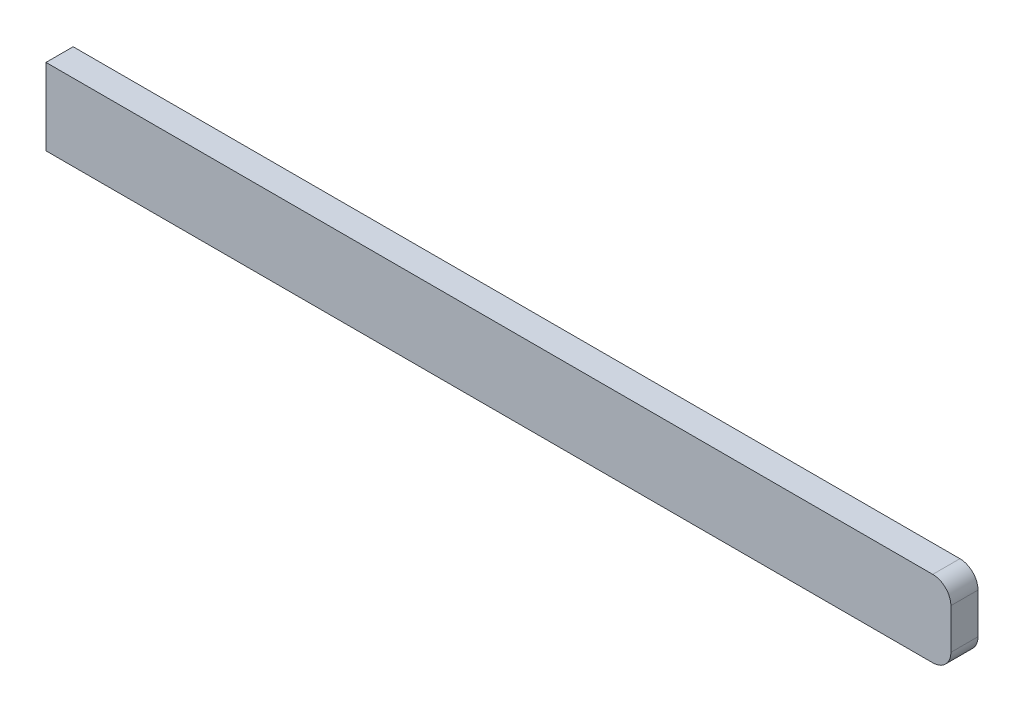
ISO-10303-21;
HEADER;
FILE_DESCRIPTION(('STEP AP214'),'2;1');
FILE_NAME('part.step','',(''),(''),'','','');
FILE_SCHEMA(('AUTOMOTIVE_DESIGN { 1 0 10303 214 1 1 1 1 }'));
ENDSEC;
DATA;
#1=APPLICATION_CONTEXT('core data for automotive mechanical design processes');
#2=APPLICATION_PROTOCOL_DEFINITION('international standard','automotive_design',2000,#1);
#3=PRODUCT_CONTEXT('',#1,'mechanical');
#4=PRODUCT('Part','Part','',(#3));
#5=PRODUCT_RELATED_PRODUCT_CATEGORY('part','',(#4));
#6=PRODUCT_DEFINITION_FORMATION('','',#4);
#7=PRODUCT_DEFINITION_CONTEXT('part definition',#1,'design');
#8=PRODUCT_DEFINITION('design','',#6,#7);
#9=PRODUCT_DEFINITION_SHAPE('','',#8);
#10=(LENGTH_UNIT() NAMED_UNIT(*) SI_UNIT(.MILLI.,.METRE.));
#11=(NAMED_UNIT(*) PLANE_ANGLE_UNIT() SI_UNIT($,.RADIAN.));
#12=(NAMED_UNIT(*) SI_UNIT($,.STERADIAN.) SOLID_ANGLE_UNIT());
#13=UNCERTAINTY_MEASURE_WITH_UNIT(LENGTH_MEASURE(1.E-05),#10,'distance_accuracy_value','');
#14=(GEOMETRIC_REPRESENTATION_CONTEXT(3) GLOBAL_UNCERTAINTY_ASSIGNED_CONTEXT((#13)) GLOBAL_UNIT_ASSIGNED_CONTEXT((#10,
#11,#12)) REPRESENTATION_CONTEXT('',''));
#15=CARTESIAN_POINT('',(0.,0.,0.));
#16=DIRECTION('',(0.,0.,1.));
#17=DIRECTION('',(1.,0.,0.));
#18=AXIS2_PLACEMENT_3D('',#15,#16,#17);
#19=CARTESIAN_POINT('',(-12.7,77.7,4.5));
#20=DIRECTION('',(1.,0.,0.));
#21=DIRECTION('',(0.,1.,0.));
#22=AXIS2_PLACEMENT_3D('',#19,#20,#21);
#23=PLANE('',#22);
#24=DIRECTION('',(0.,-1.,0.));
#25=VECTOR('',#24,1.);
#26=CARTESIAN_POINT('',(-12.7,77.7,0.));
#27=LINE('',#26,#25);
#28=CARTESIAN_POINT('',(-12.7,77.7,0.));
#29=VERTEX_POINT('',#28);
#30=CARTESIAN_POINT('',(-12.7,65.,0.));
#31=VERTEX_POINT('',#30);
#32=EDGE_CURVE('E105',#29,#31,#27,.T.);
#33=ORIENTED_EDGE('',*,*,#32,.T.);
#34=DIRECTION('',(0.,0.,-1.));
#35=VECTOR('',#34,1.);
#36=CARTESIAN_POINT('',(-12.7,65.,4.5));
#37=LINE('',#36,#35);
#38=CARTESIAN_POINT('',(-12.7,65.,4.5));
#39=VERTEX_POINT('',#38);
#40=EDGE_CURVE('E90',#39,#31,#37,.T.);
#41=ORIENTED_EDGE('',*,*,#40,.F.);
#42=DIRECTION('',(0.,-1.,0.));
#43=VECTOR('',#42,1.);
#44=CARTESIAN_POINT('',(-12.7,77.7,4.5));
#45=LINE('',#44,#43);
#46=CARTESIAN_POINT('',(-12.7,77.7,4.5));
#47=VERTEX_POINT('',#46);
#48=EDGE_CURVE('E94',#47,#39,#45,.T.);
#49=ORIENTED_EDGE('',*,*,#48,.F.);
#50=DIRECTION('',(0.,0.,-1.));
#51=VECTOR('',#50,1.);
#52=CARTESIAN_POINT('',(-12.7,77.7,4.5));
#53=LINE('',#52,#51);
#54=EDGE_CURVE('E107',#47,#29,#53,.T.);
#55=ORIENTED_EDGE('',*,*,#54,.T.);
#56=EDGE_LOOP('',(#33,#41,#49,#55));
#57=FACE_BOUND('',#56,.T.);
#58=ADVANCED_FACE('F33',(#57),#23,.F.);
#59=CARTESIAN_POINT('',(-12.7,65.,4.5));
#60=DIRECTION('',(0.,1.,0.));
#61=DIRECTION('',(0.,0.,1.));
#62=AXIS2_PLACEMENT_3D('',#59,#60,#61);
#63=PLANE('',#62);
#64=DIRECTION('',(1.,0.,0.));
#65=VECTOR('',#64,1.);
#66=CARTESIAN_POINT('',(-12.7,65.,0.));
#67=LINE('',#66,#65);
#68=CARTESIAN_POINT('',(134.3,65.,0.));
#69=VERTEX_POINT('',#68);
#70=EDGE_CURVE('E133',#31,#69,#67,.T.);
#71=ORIENTED_EDGE('',*,*,#70,.T.);
#72=DIRECTION('',(0.,0.,-1.));
#73=VECTOR('',#72,1.);
#74=CARTESIAN_POINT('',(134.3,65.,4.5));
#75=LINE('',#74,#73);
#76=CARTESIAN_POINT('',(134.3,65.,4.5));
#77=VERTEX_POINT('',#76);
#78=EDGE_CURVE('E56',#69,#77,#75,.F.);
#79=ORIENTED_EDGE('',*,*,#78,.T.);
#80=DIRECTION('',(1.,0.,0.));
#81=VECTOR('',#80,1.);
#82=CARTESIAN_POINT('',(-12.7,65.,4.5));
#83=LINE('',#82,#81);
#84=EDGE_CURVE('E86',#39,#77,#83,.T.);
#85=ORIENTED_EDGE('',*,*,#84,.F.);
#86=ORIENTED_EDGE('',*,*,#40,.T.);
#87=EDGE_LOOP('',(#71,#79,#85,#86));
#88=FACE_BOUND('',#87,.T.);
#89=ADVANCED_FACE('F88',(#88),#63,.F.);
#90=CARTESIAN_POINT('',(137.3,77.7,4.5));
#91=DIRECTION('',(-1.,0.,0.));
#92=DIRECTION('',(0.,0.,1.));
#93=AXIS2_PLACEMENT_3D('',#90,#91,#92);
#94=PLANE('',#93);
#95=DIRECTION('',(0.,1.,0.));
#96=VECTOR('',#95,1.);
#97=CARTESIAN_POINT('',(137.3,77.7,4.5));
#98=LINE('',#97,#96);
#99=CARTESIAN_POINT('',(137.3,68.,4.5));
#100=VERTEX_POINT('',#99);
#101=CARTESIAN_POINT('',(137.3,74.7,4.5));
#102=VERTEX_POINT('',#101);
#103=EDGE_CURVE('E93',#100,#102,#98,.T.);
#104=ORIENTED_EDGE('',*,*,#103,.F.);
#105=DIRECTION('',(0.,0.,-1.));
#106=VECTOR('',#105,1.);
#107=CARTESIAN_POINT('',(137.3,68.,4.5));
#108=LINE('',#107,#106);
#109=CARTESIAN_POINT('',(137.3,68.,0.));
#110=VERTEX_POINT('',#109);
#111=EDGE_CURVE('E109',#100,#110,#108,.T.);
#112=ORIENTED_EDGE('',*,*,#111,.T.);
#113=DIRECTION('',(0.,1.,0.));
#114=VECTOR('',#113,1.);
#115=CARTESIAN_POINT('',(137.3,77.7,0.));
#116=LINE('',#115,#114);
#117=CARTESIAN_POINT('',(137.3,74.7,0.));
#118=VERTEX_POINT('',#117);
#119=EDGE_CURVE('E134',#110,#118,#116,.T.);
#120=ORIENTED_EDGE('',*,*,#119,.T.);
#121=DIRECTION('',(0.,0.,-1.));
#122=VECTOR('',#121,1.);
#123=CARTESIAN_POINT('',(137.3,74.7,4.5));
#124=LINE('',#123,#122);
#125=EDGE_CURVE('E106',#118,#102,#124,.F.);
#126=ORIENTED_EDGE('',*,*,#125,.T.);
#127=EDGE_LOOP('',(#104,#112,#120,#126));
#128=FACE_BOUND('',#127,.T.);
#129=ADVANCED_FACE('F125',(#128),#94,.F.);
#130=CARTESIAN_POINT('',(-12.7,77.7,4.5));
#131=DIRECTION('',(0.,-1.,0.));
#132=DIRECTION('',(0.,0.,-1.));
#133=AXIS2_PLACEMENT_3D('',#130,#131,#132);
#134=PLANE('',#133);
#135=DIRECTION('',(-1.,0.,0.));
#136=VECTOR('',#135,1.);
#137=CARTESIAN_POINT('',(-12.7,77.7,4.5));
#138=LINE('',#137,#136);
#139=CARTESIAN_POINT('',(134.3,77.7,4.5));
#140=VERTEX_POINT('',#139);
#141=EDGE_CURVE('E98',#140,#47,#138,.T.);
#142=ORIENTED_EDGE('',*,*,#141,.F.);
#143=DIRECTION('',(0.,0.,-1.));
#144=VECTOR('',#143,1.);
#145=CARTESIAN_POINT('',(134.3,77.7,4.5));
#146=LINE('',#145,#144);
#147=CARTESIAN_POINT('',(134.3,77.7,0.));
#148=VERTEX_POINT('',#147);
#149=EDGE_CURVE('E11',#140,#148,#146,.T.);
#150=ORIENTED_EDGE('',*,*,#149,.T.);
#151=DIRECTION('',(-1.,0.,0.));
#152=VECTOR('',#151,1.);
#153=CARTESIAN_POINT('',(-12.7,77.7,0.));
#154=LINE('',#153,#152);
#155=EDGE_CURVE('E102',#148,#29,#154,.T.);
#156=ORIENTED_EDGE('',*,*,#155,.T.);
#157=ORIENTED_EDGE('',*,*,#54,.F.);
#158=EDGE_LOOP('',(#142,#150,#156,#157));
#159=FACE_BOUND('',#158,.T.);
#160=ADVANCED_FACE('F141',(#159),#134,.F.);
#161=CARTESIAN_POINT('',(0.,0.,4.5));
#162=DIRECTION('',(0.,0.,1.));
#163=DIRECTION('',(1.,0.,0.));
#164=AXIS2_PLACEMENT_3D('',#161,#162,#163);
#165=PLANE('',#164);
#166=ORIENTED_EDGE('',*,*,#84,.T.);
#167=CARTESIAN_POINT('',(134.3,68.,4.5));
#168=DIRECTION('',(0.,0.,1.));
#169=DIRECTION('',(1.,0.,0.));
#170=AXIS2_PLACEMENT_3D('',#167,#168,#169);
#171=CIRCLE('',#170,3.);
#172=EDGE_CURVE('E41',#77,#100,#171,.T.);
#173=ORIENTED_EDGE('',*,*,#172,.T.);
#174=ORIENTED_EDGE('',*,*,#103,.T.);
#175=CARTESIAN_POINT('',(134.3,74.7,4.5));
#176=DIRECTION('',(0.,0.,1.));
#177=DIRECTION('',(1.,0.,0.));
#178=AXIS2_PLACEMENT_3D('',#175,#176,#177);
#179=CIRCLE('',#178,3.);
#180=EDGE_CURVE('E48',#102,#140,#179,.T.);
#181=ORIENTED_EDGE('',*,*,#180,.T.);
#182=ORIENTED_EDGE('',*,*,#141,.T.);
#183=ORIENTED_EDGE('',*,*,#48,.T.);
#184=EDGE_LOOP('',(#166,#173,#174,#181,#182,#183));
#185=FACE_BOUND('',#184,.T.);
#186=ADVANCED_FACE('F97',(#185),#165,.T.);
#187=CARTESIAN_POINT('',(0.,0.,0.));
#188=DIRECTION('',(0.,0.,1.));
#189=DIRECTION('',(1.,0.,0.));
#190=AXIS2_PLACEMENT_3D('',#187,#188,#189);
#191=PLANE('',#190);
#192=ORIENTED_EDGE('',*,*,#119,.F.);
#193=CARTESIAN_POINT('',(134.3,68.,0.));
#194=DIRECTION('',(0.,0.,1.));
#195=DIRECTION('',(1.,0.,0.));
#196=AXIS2_PLACEMENT_3D('',#193,#194,#195);
#197=CIRCLE('',#196,3.);
#198=EDGE_CURVE('E118',#110,#69,#197,.F.);
#199=ORIENTED_EDGE('',*,*,#198,.T.);
#200=ORIENTED_EDGE('',*,*,#70,.F.);
#201=ORIENTED_EDGE('',*,*,#32,.F.);
#202=ORIENTED_EDGE('',*,*,#155,.F.);
#203=CARTESIAN_POINT('',(134.3,74.7,0.));
#204=DIRECTION('',(0.,0.,1.));
#205=DIRECTION('',(1.,0.,0.));
#206=AXIS2_PLACEMENT_3D('',#203,#204,#205);
#207=CIRCLE('',#206,3.);
#208=EDGE_CURVE('E116',#148,#118,#207,.F.);
#209=ORIENTED_EDGE('',*,*,#208,.T.);
#210=EDGE_LOOP('',(#192,#199,#200,#201,#202,#209));
#211=FACE_BOUND('',#210,.T.);
#212=ADVANCED_FACE('F132',(#211),#191,.F.);
#213=CARTESIAN_POINT('',(134.3,68.,4.5));
#214=DIRECTION('',(0.,0.,-1.));
#215=DIRECTION('',(-1.,0.,0.));
#216=AXIS2_PLACEMENT_3D('',#213,#214,#215);
#217=CYLINDRICAL_SURFACE('',#216,3.);
#218=ORIENTED_EDGE('',*,*,#172,.F.);
#219=ORIENTED_EDGE('',*,*,#78,.F.);
#220=ORIENTED_EDGE('',*,*,#198,.F.);
#221=ORIENTED_EDGE('',*,*,#111,.F.);
#222=EDGE_LOOP('',(#218,#219,#220,#221));
#223=FACE_BOUND('',#222,.T.);
#224=ADVANCED_FACE('F130',(#223),#217,.T.);
#225=CARTESIAN_POINT('',(134.3,74.7,4.5));
#226=DIRECTION('',(0.,0.,-1.));
#227=DIRECTION('',(-1.,0.,0.));
#228=AXIS2_PLACEMENT_3D('',#225,#226,#227);
#229=CYLINDRICAL_SURFACE('',#228,3.);
#230=ORIENTED_EDGE('',*,*,#180,.F.);
#231=ORIENTED_EDGE('',*,*,#125,.F.);
#232=ORIENTED_EDGE('',*,*,#208,.F.);
#233=ORIENTED_EDGE('',*,*,#149,.F.);
#234=EDGE_LOOP('',(#230,#231,#232,#233));
#235=FACE_BOUND('',#234,.T.);
#236=ADVANCED_FACE('F35',(#235),#229,.T.);
#237=CLOSED_SHELL('',(#58,#89,#129,#160,#186,#212,#224,#236));
#238=MANIFOLD_SOLID_BREP('B2',#237);
#239=ADVANCED_BREP_SHAPE_REPRESENTATION('',(#18,#238),#14);
#240=SHAPE_DEFINITION_REPRESENTATION(#9,#239);
ENDSEC;
END-ISO-10303-21;
